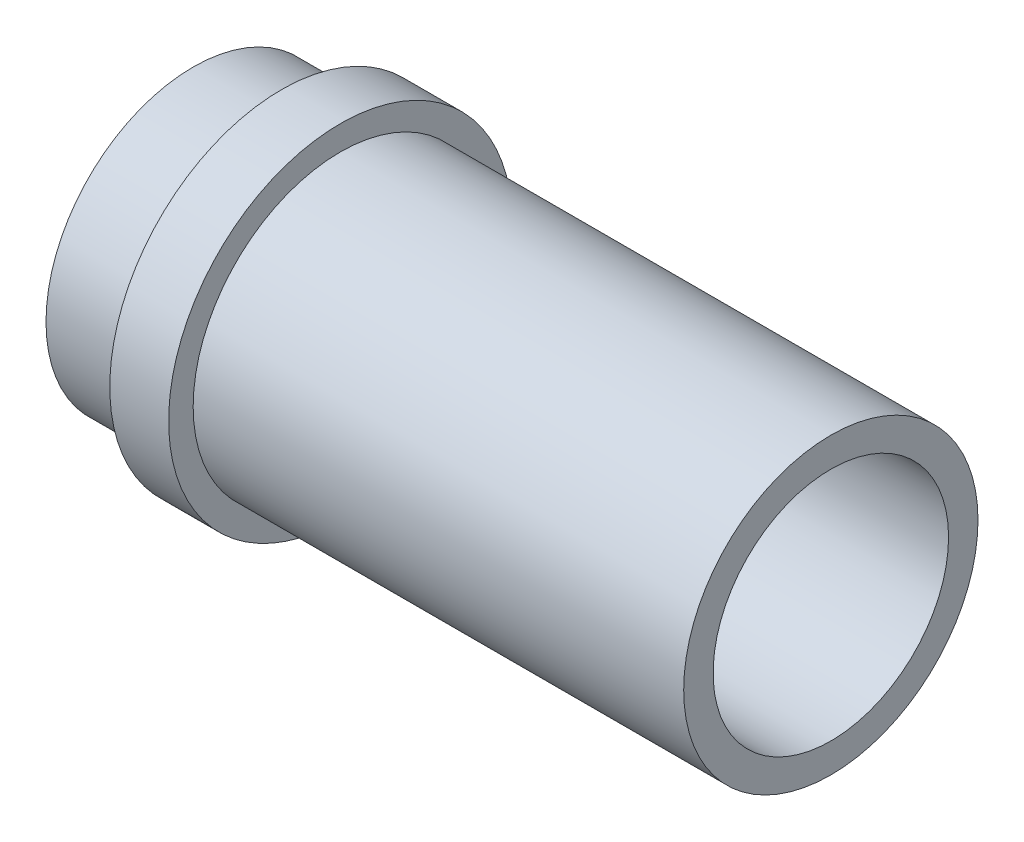
ISO-10303-21;
HEADER;
FILE_DESCRIPTION(('STEP AP214'),'2;1');
FILE_NAME('part.step','',(''),(''),'','','');
FILE_SCHEMA(('AUTOMOTIVE_DESIGN { 1 0 10303 214 1 1 1 1 }'));
ENDSEC;
DATA;
#1=APPLICATION_CONTEXT('core data for automotive mechanical design processes');
#2=APPLICATION_PROTOCOL_DEFINITION('international standard','automotive_design',2000,#1);
#3=PRODUCT_CONTEXT('',#1,'mechanical');
#4=PRODUCT('Part','Part','',(#3));
#5=PRODUCT_RELATED_PRODUCT_CATEGORY('part','',(#4));
#6=PRODUCT_DEFINITION_FORMATION('','',#4);
#7=PRODUCT_DEFINITION_CONTEXT('part definition',#1,'design');
#8=PRODUCT_DEFINITION('design','',#6,#7);
#9=PRODUCT_DEFINITION_SHAPE('','',#8);
#10=(LENGTH_UNIT() NAMED_UNIT(*) SI_UNIT(.MILLI.,.METRE.));
#11=(NAMED_UNIT(*) PLANE_ANGLE_UNIT() SI_UNIT($,.RADIAN.));
#12=(NAMED_UNIT(*) SI_UNIT($,.STERADIAN.) SOLID_ANGLE_UNIT());
#13=UNCERTAINTY_MEASURE_WITH_UNIT(LENGTH_MEASURE(1.E-05),#10,'distance_accuracy_value','');
#14=(GEOMETRIC_REPRESENTATION_CONTEXT(3) GLOBAL_UNCERTAINTY_ASSIGNED_CONTEXT((#13)) GLOBAL_UNIT_ASSIGNED_CONTEXT((#10,
#11,#12)) REPRESENTATION_CONTEXT('',''));
#15=CARTESIAN_POINT('',(0.,0.,0.));
#16=DIRECTION('',(0.,0.,1.));
#17=DIRECTION('',(1.,0.,0.));
#18=AXIS2_PLACEMENT_3D('',#15,#16,#17);
#19=CARTESIAN_POINT('',(65.,0.,0.));
#20=DIRECTION('',(1.,0.,0.));
#21=DIRECTION('',(0.,0.,-1.));
#22=AXIS2_PLACEMENT_3D('',#19,#20,#21);
#23=CYLINDRICAL_SURFACE('',#22,15.);
#24=CARTESIAN_POINT('',(0.,0.,0.));
#25=DIRECTION('',(1.,0.,0.));
#26=DIRECTION('',(0.,0.,-1.));
#27=AXIS2_PLACEMENT_3D('',#24,#25,#26);
#28=CIRCLE('',#27,15.);
#29=CARTESIAN_POINT('',(0.,0.,-15.));
#30=VERTEX_POINT('',#29);
#31=EDGE_CURVE('E51',#30,#30,#28,.T.);
#32=ORIENTED_EDGE('',*,*,#31,.T.);
#33=EDGE_LOOP('',(#32));
#34=FACE_BOUND('',#33,.T.);
#35=CARTESIAN_POINT('',(9.,0.,0.));
#36=DIRECTION('',(1.,0.,0.));
#37=DIRECTION('',(0.,0.,-1.));
#38=AXIS2_PLACEMENT_3D('',#35,#36,#37);
#39=CIRCLE('',#38,15.);
#40=CARTESIAN_POINT('',(9.,0.,-15.));
#41=VERTEX_POINT('',#40);
#42=EDGE_CURVE('E47',#41,#41,#39,.T.);
#43=ORIENTED_EDGE('',*,*,#42,.F.);
#44=EDGE_LOOP('',(#43));
#45=FACE_BOUND('',#44,.T.);
#46=ADVANCED_FACE('F14',(#34,#45),#23,.T.);
#47=CARTESIAN_POINT('',(0.,15.,0.));
#48=DIRECTION('',(-1.,0.,0.));
#49=DIRECTION('',(0.,0.,1.));
#50=AXIS2_PLACEMENT_3D('',#47,#48,#49);
#51=PLANE('',#50);
#52=CARTESIAN_POINT('',(0.,0.,0.));
#53=DIRECTION('',(1.,0.,0.));
#54=DIRECTION('',(0.,0.,-1.));
#55=AXIS2_PLACEMENT_3D('',#52,#53,#54);
#56=CIRCLE('',#55,12.);
#57=CARTESIAN_POINT('',(0.,0.,-12.));
#58=VERTEX_POINT('',#57);
#59=EDGE_CURVE('E43',#58,#58,#56,.T.);
#60=ORIENTED_EDGE('',*,*,#59,.T.);
#61=EDGE_LOOP('',(#60));
#62=FACE_BOUND('',#61,.T.);
#63=ORIENTED_EDGE('',*,*,#31,.F.);
#64=EDGE_LOOP('',(#63));
#65=FACE_BOUND('',#64,.T.);
#66=ADVANCED_FACE('F58',(#62,#65),#51,.T.);
#67=CARTESIAN_POINT('',(9.,17.5,0.));
#68=DIRECTION('',(-1.,0.,0.));
#69=DIRECTION('',(0.,0.,1.));
#70=AXIS2_PLACEMENT_3D('',#67,#68,#69);
#71=PLANE('',#70);
#72=ORIENTED_EDGE('',*,*,#42,.T.);
#73=EDGE_LOOP('',(#72));
#74=FACE_BOUND('',#73,.T.);
#75=CARTESIAN_POINT('',(9.,0.,0.));
#76=DIRECTION('',(1.,0.,0.));
#77=DIRECTION('',(0.,0.,-1.));
#78=AXIS2_PLACEMENT_3D('',#75,#76,#77);
#79=CIRCLE('',#78,17.5);
#80=CARTESIAN_POINT('',(9.,0.,-17.5));
#81=VERTEX_POINT('',#80);
#82=EDGE_CURVE('E39',#81,#81,#79,.T.);
#83=ORIENTED_EDGE('',*,*,#82,.F.);
#84=EDGE_LOOP('',(#83));
#85=FACE_BOUND('',#84,.T.);
#86=ADVANCED_FACE('F60',(#74,#85),#71,.T.);
#87=CARTESIAN_POINT('',(65.,0.,0.));
#88=DIRECTION('',(1.,0.,0.));
#89=DIRECTION('',(0.,0.,-1.));
#90=AXIS2_PLACEMENT_3D('',#87,#88,#89);
#91=CYLINDRICAL_SURFACE('',#90,12.);
#92=CARTESIAN_POINT('',(65.,0.,0.));
#93=DIRECTION('',(1.,0.,0.));
#94=DIRECTION('',(0.,0.,-1.));
#95=AXIS2_PLACEMENT_3D('',#92,#93,#94);
#96=CIRCLE('',#95,12.);
#97=CARTESIAN_POINT('',(65.,0.,-12.));
#98=VERTEX_POINT('',#97);
#99=EDGE_CURVE('E33',#98,#98,#96,.T.);
#100=ORIENTED_EDGE('',*,*,#99,.T.);
#101=EDGE_LOOP('',(#100));
#102=FACE_BOUND('',#101,.T.);
#103=ORIENTED_EDGE('',*,*,#59,.F.);
#104=EDGE_LOOP('',(#103));
#105=FACE_BOUND('',#104,.T.);
#106=ADVANCED_FACE('F68',(#102,#105),#91,.F.);
#107=CARTESIAN_POINT('',(65.,0.,0.));
#108=DIRECTION('',(1.,0.,0.));
#109=DIRECTION('',(0.,0.,-1.));
#110=AXIS2_PLACEMENT_3D('',#107,#108,#109);
#111=CYLINDRICAL_SURFACE('',#110,17.5);
#112=ORIENTED_EDGE('',*,*,#82,.T.);
#113=EDGE_LOOP('',(#112));
#114=FACE_BOUND('',#113,.T.);
#115=CARTESIAN_POINT('',(15.,0.,0.));
#116=DIRECTION('',(1.,0.,0.));
#117=DIRECTION('',(0.,0.,-1.));
#118=AXIS2_PLACEMENT_3D('',#115,#116,#117);
#119=CIRCLE('',#118,17.5);
#120=CARTESIAN_POINT('',(15.,0.,-17.5));
#121=VERTEX_POINT('',#120);
#122=EDGE_CURVE('E28',#121,#121,#119,.T.);
#123=ORIENTED_EDGE('',*,*,#122,.F.);
#124=EDGE_LOOP('',(#123));
#125=FACE_BOUND('',#124,.T.);
#126=ADVANCED_FACE('F75',(#114,#125),#111,.T.);
#127=CARTESIAN_POINT('',(65.,12.,0.));
#128=DIRECTION('',(1.,0.,0.));
#129=DIRECTION('',(0.,0.,-1.));
#130=AXIS2_PLACEMENT_3D('',#127,#128,#129);
#131=PLANE('',#130);
#132=CARTESIAN_POINT('',(65.,0.,0.));
#133=DIRECTION('',(1.,0.,0.));
#134=DIRECTION('',(0.,0.,-1.));
#135=AXIS2_PLACEMENT_3D('',#132,#133,#134);
#136=CIRCLE('',#135,15.);
#137=CARTESIAN_POINT('',(65.,0.,-15.));
#138=VERTEX_POINT('',#137);
#139=EDGE_CURVE('E22',#138,#138,#136,.T.);
#140=ORIENTED_EDGE('',*,*,#139,.T.);
#141=EDGE_LOOP('',(#140));
#142=FACE_BOUND('',#141,.T.);
#143=ORIENTED_EDGE('',*,*,#99,.F.);
#144=EDGE_LOOP('',(#143));
#145=FACE_BOUND('',#144,.T.);
#146=ADVANCED_FACE('F79',(#142,#145),#131,.T.);
#147=CARTESIAN_POINT('',(15.,15.,0.));
#148=DIRECTION('',(1.,0.,0.));
#149=DIRECTION('',(0.,0.,-1.));
#150=AXIS2_PLACEMENT_3D('',#147,#148,#149);
#151=PLANE('',#150);
#152=ORIENTED_EDGE('',*,*,#122,.T.);
#153=EDGE_LOOP('',(#152));
#154=FACE_BOUND('',#153,.T.);
#155=CARTESIAN_POINT('',(15.,0.,0.));
#156=DIRECTION('',(1.,0.,0.));
#157=DIRECTION('',(0.,0.,-1.));
#158=AXIS2_PLACEMENT_3D('',#155,#156,#157);
#159=CIRCLE('',#158,15.);
#160=CARTESIAN_POINT('',(15.,0.,-15.));
#161=VERTEX_POINT('',#160);
#162=EDGE_CURVE('E9',#161,#161,#159,.T.);
#163=ORIENTED_EDGE('',*,*,#162,.F.);
#164=EDGE_LOOP('',(#163));
#165=FACE_BOUND('',#164,.T.);
#166=ADVANCED_FACE('F82',(#154,#165),#151,.T.);
#167=CARTESIAN_POINT('',(65.,0.,0.));
#168=DIRECTION('',(1.,0.,0.));
#169=DIRECTION('',(0.,0.,-1.));
#170=AXIS2_PLACEMENT_3D('',#167,#168,#169);
#171=CYLINDRICAL_SURFACE('',#170,15.);
#172=ORIENTED_EDGE('',*,*,#162,.T.);
#173=EDGE_LOOP('',(#172));
#174=FACE_BOUND('',#173,.T.);
#175=ORIENTED_EDGE('',*,*,#139,.F.);
#176=EDGE_LOOP('',(#175));
#177=FACE_BOUND('',#176,.T.);
#178=ADVANCED_FACE('F16',(#174,#177),#171,.T.);
#179=CLOSED_SHELL('',(#46,#66,#86,#106,#126,#146,#166,#178));
#180=MANIFOLD_SOLID_BREP('B1',#179);
#181=ADVANCED_BREP_SHAPE_REPRESENTATION('',(#18,#180),#14);
#182=SHAPE_DEFINITION_REPRESENTATION(#9,#181);
ENDSEC;
END-ISO-10303-21;
